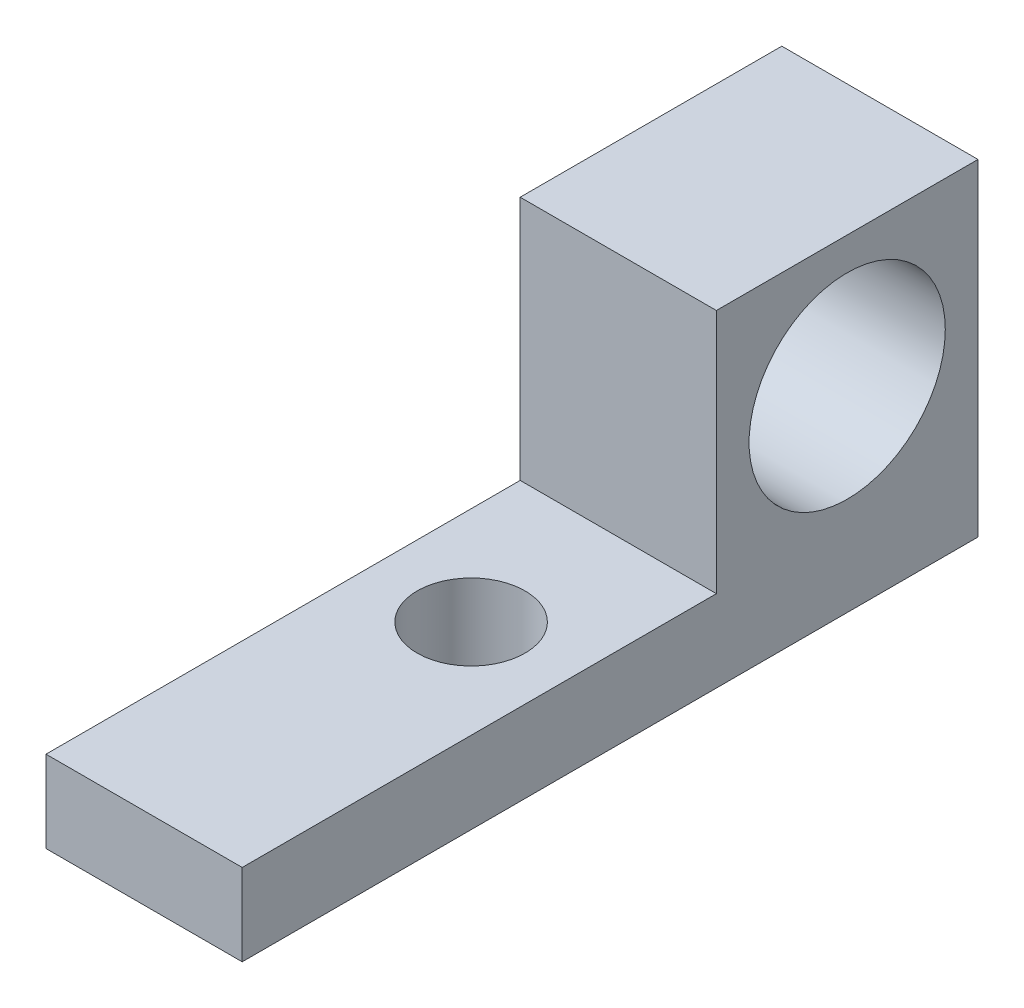
ISO-10303-21;
HEADER;
FILE_DESCRIPTION(('STEP AP214'),'2;1');
FILE_NAME('part.step','',(''),(''),'','','');
FILE_SCHEMA(('AUTOMOTIVE_DESIGN { 1 0 10303 214 1 1 1 1 }'));
ENDSEC;
DATA;
#1=APPLICATION_CONTEXT('core data for automotive mechanical design processes');
#2=APPLICATION_PROTOCOL_DEFINITION('international standard','automotive_design',2000,#1);
#3=PRODUCT_CONTEXT('',#1,'mechanical');
#4=PRODUCT('Part','Part','',(#3));
#5=PRODUCT_RELATED_PRODUCT_CATEGORY('part','',(#4));
#6=PRODUCT_DEFINITION_FORMATION('','',#4);
#7=PRODUCT_DEFINITION_CONTEXT('part definition',#1,'design');
#8=PRODUCT_DEFINITION('design','',#6,#7);
#9=PRODUCT_DEFINITION_SHAPE('','',#8);
#10=(LENGTH_UNIT() NAMED_UNIT(*) SI_UNIT(.MILLI.,.METRE.));
#11=(NAMED_UNIT(*) PLANE_ANGLE_UNIT() SI_UNIT($,.RADIAN.));
#12=(NAMED_UNIT(*) SI_UNIT($,.STERADIAN.) SOLID_ANGLE_UNIT());
#13=UNCERTAINTY_MEASURE_WITH_UNIT(LENGTH_MEASURE(1.E-05),#10,'distance_accuracy_value','');
#14=(GEOMETRIC_REPRESENTATION_CONTEXT(3) GLOBAL_UNCERTAINTY_ASSIGNED_CONTEXT((#13)) GLOBAL_UNIT_ASSIGNED_CONTEXT((#10,
#11,#12)) REPRESENTATION_CONTEXT('',''));
#15=CARTESIAN_POINT('',(0.,0.,0.));
#16=DIRECTION('',(0.,0.,1.));
#17=DIRECTION('',(1.,0.,0.));
#18=AXIS2_PLACEMENT_3D('',#15,#16,#17);
#19=CARTESIAN_POINT('',(12.,0.,0.));
#20=DIRECTION('',(1.,0.,0.));
#21=DIRECTION('',(0.,0.,-1.));
#22=AXIS2_PLACEMENT_3D('',#19,#20,#21);
#23=PLANE('',#22);
#24=DIRECTION('',(0.,-1.,0.));
#25=VECTOR('',#24,1.);
#26=CARTESIAN_POINT('',(12.,5.,0.));
#27=LINE('',#26,#25);
#28=CARTESIAN_POINT('',(12.,5.,0.));
#29=VERTEX_POINT('',#28);
#30=CARTESIAN_POINT('',(12.,0.,0.));
#31=VERTEX_POINT('',#30);
#32=EDGE_CURVE('E127',#29,#31,#27,.T.);
#33=ORIENTED_EDGE('',*,*,#32,.T.);
#34=DIRECTION('',(0.,0.,-1.));
#35=VECTOR('',#34,1.);
#36=CARTESIAN_POINT('',(12.,0.,0.));
#37=LINE('',#36,#35);
#38=CARTESIAN_POINT('',(12.,0.,-45.));
#39=VERTEX_POINT('',#38);
#40=EDGE_CURVE('E85',#31,#39,#37,.T.);
#41=ORIENTED_EDGE('',*,*,#40,.T.);
#42=DIRECTION('',(0.,1.,0.));
#43=VECTOR('',#42,1.);
#44=CARTESIAN_POINT('',(12.,0.,-45.));
#45=LINE('',#44,#43);
#46=CARTESIAN_POINT('',(12.,20.,-45.));
#47=VERTEX_POINT('',#46);
#48=EDGE_CURVE('E98',#39,#47,#45,.T.);
#49=ORIENTED_EDGE('',*,*,#48,.T.);
#50=DIRECTION('',(0.,0.,1.));
#51=VECTOR('',#50,1.);
#52=CARTESIAN_POINT('',(12.,20.,-45.));
#53=LINE('',#52,#51);
#54=CARTESIAN_POINT('',(12.,20.,-29.));
#55=VERTEX_POINT('',#54);
#56=EDGE_CURVE('E92',#47,#55,#53,.T.);
#57=ORIENTED_EDGE('',*,*,#56,.T.);
#58=DIRECTION('',(0.,-1.,0.));
#59=VECTOR('',#58,1.);
#60=CARTESIAN_POINT('',(12.,20.,-29.));
#61=LINE('',#60,#59);
#62=CARTESIAN_POINT('',(12.,5.,-29.));
#63=VERTEX_POINT('',#62);
#64=EDGE_CURVE('E96',#55,#63,#61,.T.);
#65=ORIENTED_EDGE('',*,*,#64,.T.);
#66=DIRECTION('',(0.,0.,1.));
#67=VECTOR('',#66,1.);
#68=CARTESIAN_POINT('',(12.,5.,-29.));
#69=LINE('',#68,#67);
#70=EDGE_CURVE('E48',#63,#29,#69,.T.);
#71=ORIENTED_EDGE('',*,*,#70,.T.);
#72=EDGE_LOOP('',(#33,#41,#49,#57,#65,#71));
#73=FACE_BOUND('',#72,.T.);
#74=CARTESIAN_POINT('',(12.,12.,-37.));
#75=DIRECTION('',(1.,0.,0.));
#76=DIRECTION('',(0.,0.,-1.));
#77=AXIS2_PLACEMENT_3D('',#74,#75,#76);
#78=CIRCLE('',#77,6.);
#79=CARTESIAN_POINT('',(12.,12.,-43.));
#80=VERTEX_POINT('',#79);
#81=EDGE_CURVE('E120',#80,#80,#78,.T.);
#82=ORIENTED_EDGE('',*,*,#81,.F.);
#83=EDGE_LOOP('',(#82));
#84=FACE_BOUND('',#83,.T.);
#85=ADVANCED_FACE('F31',(#73,#84),#23,.T.);
#86=CARTESIAN_POINT('',(0.,0.,0.));
#87=DIRECTION('',(1.,0.,0.));
#88=DIRECTION('',(0.,0.,-1.));
#89=AXIS2_PLACEMENT_3D('',#86,#87,#88);
#90=PLANE('',#89);
#91=DIRECTION('',(0.,-1.,0.));
#92=VECTOR('',#91,1.);
#93=CARTESIAN_POINT('',(0.,5.,0.));
#94=LINE('',#93,#92);
#95=CARTESIAN_POINT('',(0.,5.,0.));
#96=VERTEX_POINT('',#95);
#97=CARTESIAN_POINT('',(0.,0.,0.));
#98=VERTEX_POINT('',#97);
#99=EDGE_CURVE('E116',#96,#98,#94,.T.);
#100=ORIENTED_EDGE('',*,*,#99,.F.);
#101=DIRECTION('',(0.,0.,1.));
#102=VECTOR('',#101,1.);
#103=CARTESIAN_POINT('',(0.,5.,-29.));
#104=LINE('',#103,#102);
#105=CARTESIAN_POINT('',(0.,5.,-29.));
#106=VERTEX_POINT('',#105);
#107=EDGE_CURVE('E77',#106,#96,#104,.T.);
#108=ORIENTED_EDGE('',*,*,#107,.F.);
#109=DIRECTION('',(0.,-1.,0.));
#110=VECTOR('',#109,1.);
#111=CARTESIAN_POINT('',(0.,20.,-29.));
#112=LINE('',#111,#110);
#113=CARTESIAN_POINT('',(0.,20.,-29.));
#114=VERTEX_POINT('',#113);
#115=EDGE_CURVE('E71',#114,#106,#112,.T.);
#116=ORIENTED_EDGE('',*,*,#115,.F.);
#117=DIRECTION('',(0.,0.,1.));
#118=VECTOR('',#117,1.);
#119=CARTESIAN_POINT('',(0.,20.,-45.));
#120=LINE('',#119,#118);
#121=CARTESIAN_POINT('',(0.,20.,-45.));
#122=VERTEX_POINT('',#121);
#123=EDGE_CURVE('E106',#122,#114,#120,.T.);
#124=ORIENTED_EDGE('',*,*,#123,.F.);
#125=DIRECTION('',(0.,1.,0.));
#126=VECTOR('',#125,1.);
#127=CARTESIAN_POINT('',(0.,0.,-45.));
#128=LINE('',#127,#126);
#129=CARTESIAN_POINT('',(0.,0.,-45.));
#130=VERTEX_POINT('',#129);
#131=EDGE_CURVE('E122',#130,#122,#128,.T.);
#132=ORIENTED_EDGE('',*,*,#131,.F.);
#133=DIRECTION('',(0.,0.,-1.));
#134=VECTOR('',#133,1.);
#135=CARTESIAN_POINT('',(0.,0.,0.));
#136=LINE('',#135,#134);
#137=EDGE_CURVE('E119',#98,#130,#136,.T.);
#138=ORIENTED_EDGE('',*,*,#137,.F.);
#139=EDGE_LOOP('',(#100,#108,#116,#124,#132,#138));
#140=FACE_BOUND('',#139,.T.);
#141=CARTESIAN_POINT('',(0.,12.,-37.));
#142=DIRECTION('',(1.,0.,0.));
#143=DIRECTION('',(0.,0.,-1.));
#144=AXIS2_PLACEMENT_3D('',#141,#142,#143);
#145=CIRCLE('',#144,6.);
#146=CARTESIAN_POINT('',(0.,12.,-43.));
#147=VERTEX_POINT('',#146);
#148=EDGE_CURVE('E173',#147,#147,#145,.T.);
#149=ORIENTED_EDGE('',*,*,#148,.T.);
#150=EDGE_LOOP('',(#149));
#151=FACE_BOUND('',#150,.T.);
#152=ADVANCED_FACE('F136',(#140,#151),#90,.F.);
#153=CARTESIAN_POINT('',(12.,5.,0.));
#154=DIRECTION('',(0.,0.,-1.));
#155=DIRECTION('',(0.,1.,0.));
#156=AXIS2_PLACEMENT_3D('',#153,#154,#155);
#157=PLANE('',#156);
#158=ORIENTED_EDGE('',*,*,#99,.T.);
#159=DIRECTION('',(-1.,0.,0.));
#160=VECTOR('',#159,1.);
#161=CARTESIAN_POINT('',(12.,0.,0.));
#162=LINE('',#161,#160);
#163=EDGE_CURVE('E11',#31,#98,#162,.T.);
#164=ORIENTED_EDGE('',*,*,#163,.F.);
#165=ORIENTED_EDGE('',*,*,#32,.F.);
#166=DIRECTION('',(-1.,0.,0.));
#167=VECTOR('',#166,1.);
#168=CARTESIAN_POINT('',(12.,5.,0.));
#169=LINE('',#168,#167);
#170=EDGE_CURVE('E112',#29,#96,#169,.T.);
#171=ORIENTED_EDGE('',*,*,#170,.T.);
#172=EDGE_LOOP('',(#158,#164,#165,#171));
#173=FACE_BOUND('',#172,.T.);
#174=ADVANCED_FACE('F33',(#173),#157,.F.);
#175=CARTESIAN_POINT('',(12.,0.,0.));
#176=DIRECTION('',(0.,1.,0.));
#177=DIRECTION('',(0.,0.,1.));
#178=AXIS2_PLACEMENT_3D('',#175,#176,#177);
#179=PLANE('',#178);
#180=CARTESIAN_POINT('',(6.,0.,-20.));
#181=DIRECTION('',(0.,1.,0.));
#182=DIRECTION('',(0.,0.,1.));
#183=AXIS2_PLACEMENT_3D('',#180,#181,#182);
#184=CIRCLE('',#183,3.29999999999999);
#185=CARTESIAN_POINT('',(6.,0.,-16.7));
#186=VERTEX_POINT('',#185);
#187=EDGE_CURVE('E169',#186,#186,#184,.T.);
#188=ORIENTED_EDGE('',*,*,#187,.T.);
#189=EDGE_LOOP('',(#188));
#190=FACE_BOUND('',#189,.T.);
#191=ORIENTED_EDGE('',*,*,#137,.T.);
#192=DIRECTION('',(-1.,0.,0.));
#193=VECTOR('',#192,1.);
#194=CARTESIAN_POINT('',(12.,0.,-45.));
#195=LINE('',#194,#193);
#196=EDGE_CURVE('E40',#39,#130,#195,.T.);
#197=ORIENTED_EDGE('',*,*,#196,.F.);
#198=ORIENTED_EDGE('',*,*,#40,.F.);
#199=ORIENTED_EDGE('',*,*,#163,.T.);
#200=EDGE_LOOP('',(#191,#197,#198,#199));
#201=FACE_BOUND('',#200,.T.);
#202=ADVANCED_FACE('F185',(#190,#201),#179,.F.);
#203=CARTESIAN_POINT('',(12.,0.,-45.));
#204=DIRECTION('',(0.,0.,1.));
#205=DIRECTION('',(1.,0.,0.));
#206=AXIS2_PLACEMENT_3D('',#203,#204,#205);
#207=PLANE('',#206);
#208=ORIENTED_EDGE('',*,*,#131,.T.);
#209=DIRECTION('',(-1.,0.,0.));
#210=VECTOR('',#209,1.);
#211=CARTESIAN_POINT('',(12.,20.,-45.));
#212=LINE('',#211,#210);
#213=EDGE_CURVE('E107',#47,#122,#212,.T.);
#214=ORIENTED_EDGE('',*,*,#213,.F.);
#215=ORIENTED_EDGE('',*,*,#48,.F.);
#216=ORIENTED_EDGE('',*,*,#196,.T.);
#217=EDGE_LOOP('',(#208,#214,#215,#216));
#218=FACE_BOUND('',#217,.T.);
#219=ADVANCED_FACE('F133',(#218),#207,.F.);
#220=CARTESIAN_POINT('',(12.,20.,-45.));
#221=DIRECTION('',(0.,-1.,0.));
#222=DIRECTION('',(0.,0.,-1.));
#223=AXIS2_PLACEMENT_3D('',#220,#221,#222);
#224=PLANE('',#223);
#225=ORIENTED_EDGE('',*,*,#123,.T.);
#226=DIRECTION('',(-1.,0.,0.));
#227=VECTOR('',#226,1.);
#228=CARTESIAN_POINT('',(12.,20.,-29.));
#229=LINE('',#228,#227);
#230=EDGE_CURVE('E103',#55,#114,#229,.T.);
#231=ORIENTED_EDGE('',*,*,#230,.F.);
#232=ORIENTED_EDGE('',*,*,#56,.F.);
#233=ORIENTED_EDGE('',*,*,#213,.T.);
#234=EDGE_LOOP('',(#225,#231,#232,#233));
#235=FACE_BOUND('',#234,.T.);
#236=ADVANCED_FACE('F104',(#235),#224,.F.);
#237=CARTESIAN_POINT('',(12.,20.,-29.));
#238=DIRECTION('',(0.,0.,-1.));
#239=DIRECTION('',(0.,1.,0.));
#240=AXIS2_PLACEMENT_3D('',#237,#238,#239);
#241=PLANE('',#240);
#242=ORIENTED_EDGE('',*,*,#115,.T.);
#243=DIRECTION('',(-1.,0.,0.));
#244=VECTOR('',#243,1.);
#245=CARTESIAN_POINT('',(12.,5.,-29.));
#246=LINE('',#245,#244);
#247=EDGE_CURVE('E108',#63,#106,#246,.T.);
#248=ORIENTED_EDGE('',*,*,#247,.F.);
#249=ORIENTED_EDGE('',*,*,#64,.F.);
#250=ORIENTED_EDGE('',*,*,#230,.T.);
#251=EDGE_LOOP('',(#242,#248,#249,#250));
#252=FACE_BOUND('',#251,.T.);
#253=ADVANCED_FACE('F110',(#252),#241,.F.);
#254=CARTESIAN_POINT('',(12.,5.,-29.));
#255=DIRECTION('',(0.,-1.,0.));
#256=DIRECTION('',(0.,0.,-1.));
#257=AXIS2_PLACEMENT_3D('',#254,#255,#256);
#258=PLANE('',#257);
#259=CARTESIAN_POINT('',(6.,5.,-20.));
#260=DIRECTION('',(0.,1.,0.));
#261=DIRECTION('',(0.,0.,1.));
#262=AXIS2_PLACEMENT_3D('',#259,#260,#261);
#263=CIRCLE('',#262,3.29999999999999);
#264=CARTESIAN_POINT('',(6.,5.,-16.7));
#265=VERTEX_POINT('',#264);
#266=EDGE_CURVE('E171',#265,#265,#263,.T.);
#267=ORIENTED_EDGE('',*,*,#266,.F.);
#268=EDGE_LOOP('',(#267));
#269=FACE_BOUND('',#268,.T.);
#270=ORIENTED_EDGE('',*,*,#107,.T.);
#271=ORIENTED_EDGE('',*,*,#170,.F.);
#272=ORIENTED_EDGE('',*,*,#70,.F.);
#273=ORIENTED_EDGE('',*,*,#247,.T.);
#274=EDGE_LOOP('',(#270,#271,#272,#273));
#275=FACE_BOUND('',#274,.T.);
#276=ADVANCED_FACE('F141',(#269,#275),#258,.F.);
#277=CARTESIAN_POINT('',(12.,12.,-37.));
#278=DIRECTION('',(-1.,0.,0.));
#279=DIRECTION('',(0.,0.,1.));
#280=AXIS2_PLACEMENT_3D('',#277,#278,#279);
#281=CYLINDRICAL_SURFACE('',#280,6.);
#282=ORIENTED_EDGE('',*,*,#81,.T.);
#283=EDGE_LOOP('',(#282));
#284=FACE_BOUND('',#283,.T.);
#285=ORIENTED_EDGE('',*,*,#148,.F.);
#286=EDGE_LOOP('',(#285));
#287=FACE_BOUND('',#286,.T.);
#288=ADVANCED_FACE('F143',(#284,#287),#281,.F.);
#289=CARTESIAN_POINT('',(6.,5.,-20.));
#290=DIRECTION('',(0.,1.,0.));
#291=DIRECTION('',(0.,0.,1.));
#292=AXIS2_PLACEMENT_3D('',#289,#290,#291);
#293=CYLINDRICAL_SURFACE('',#292,3.29999999999999);
#294=ORIENTED_EDGE('',*,*,#187,.F.);
#295=EDGE_LOOP('',(#294));
#296=FACE_BOUND('',#295,.T.);
#297=ORIENTED_EDGE('',*,*,#266,.T.);
#298=EDGE_LOOP('',(#297));
#299=FACE_BOUND('',#298,.T.);
#300=ADVANCED_FACE('F150',(#296,#299),#293,.F.);
#301=CLOSED_SHELL('',(#85,#152,#174,#202,#219,#236,#253,#276,#288,#300));
#302=MANIFOLD_SOLID_BREP('B2',#301);
#303=ADVANCED_BREP_SHAPE_REPRESENTATION('',(#18,#302),#14);
#304=SHAPE_DEFINITION_REPRESENTATION(#9,#303);
ENDSEC;
END-ISO-10303-21;
